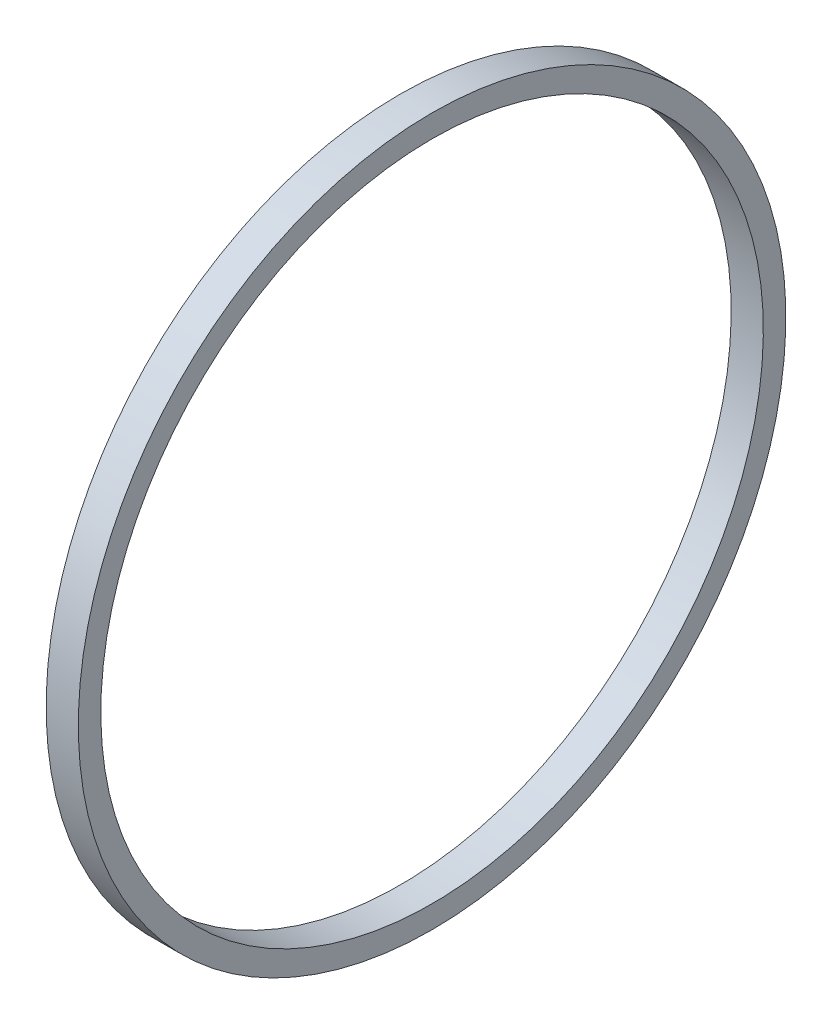
ISO-10303-21;
HEADER;
FILE_DESCRIPTION(('STEP AP214'),'2;1');
FILE_NAME('part.step','',(''),(''),'','','');
FILE_SCHEMA(('AUTOMOTIVE_DESIGN { 1 0 10303 214 1 1 1 1 }'));
ENDSEC;
DATA;
#1=APPLICATION_CONTEXT('core data for automotive mechanical design processes');
#2=APPLICATION_PROTOCOL_DEFINITION('international standard','automotive_design',2000,#1);
#3=PRODUCT_CONTEXT('',#1,'mechanical');
#4=PRODUCT('Part','Part','',(#3));
#5=PRODUCT_RELATED_PRODUCT_CATEGORY('part','',(#4));
#6=PRODUCT_DEFINITION_FORMATION('','',#4);
#7=PRODUCT_DEFINITION_CONTEXT('part definition',#1,'design');
#8=PRODUCT_DEFINITION('design','',#6,#7);
#9=PRODUCT_DEFINITION_SHAPE('','',#8);
#10=(LENGTH_UNIT() NAMED_UNIT(*) SI_UNIT(.MILLI.,.METRE.));
#11=(NAMED_UNIT(*) PLANE_ANGLE_UNIT() SI_UNIT($,.RADIAN.));
#12=(NAMED_UNIT(*) SI_UNIT($,.STERADIAN.) SOLID_ANGLE_UNIT());
#13=UNCERTAINTY_MEASURE_WITH_UNIT(LENGTH_MEASURE(1.E-05),#10,'distance_accuracy_value','');
#14=(GEOMETRIC_REPRESENTATION_CONTEXT(3) GLOBAL_UNCERTAINTY_ASSIGNED_CONTEXT((#13)) GLOBAL_UNIT_ASSIGNED_CONTEXT((#10,
#11,#12)) REPRESENTATION_CONTEXT('',''));
#15=CARTESIAN_POINT('',(0.,0.,0.));
#16=DIRECTION('',(0.,0.,1.));
#17=DIRECTION('',(1.,0.,0.));
#18=AXIS2_PLACEMENT_3D('',#15,#16,#17);
#19=CARTESIAN_POINT('',(0.,0.,0.));
#20=DIRECTION('',(1.,0.,0.));
#21=DIRECTION('',(0.,1.,0.));
#22=AXIS2_PLACEMENT_3D('',#19,#20,#21);
#23=PLANE('',#22);
#24=CARTESIAN_POINT('',(0.,0.,0.));
#25=DIRECTION('',(-1.,0.,0.));
#26=DIRECTION('',(0.,-1.,0.));
#27=AXIS2_PLACEMENT_3D('',#24,#25,#26);
#28=CIRCLE('',#27,51.5);
#29=CARTESIAN_POINT('',(0.,51.5,0.));
#30=VERTEX_POINT('',#29);
#31=EDGE_CURVE('E59',#30,#30,#28,.T.);
#32=ORIENTED_EDGE('',*,*,#31,.F.);
#33=EDGE_LOOP('',(#32));
#34=FACE_BOUND('',#33,.T.);
#35=CARTESIAN_POINT('',(0.,0.,0.));
#36=DIRECTION('',(1.,0.,0.));
#37=DIRECTION('',(0.,1.,0.));
#38=AXIS2_PLACEMENT_3D('',#35,#36,#37);
#39=CIRCLE('',#38,55.);
#40=CARTESIAN_POINT('',(0.,-55.,0.));
#41=VERTEX_POINT('',#40);
#42=EDGE_CURVE('E11',#41,#41,#39,.T.);
#43=ORIENTED_EDGE('',*,*,#42,.F.);
#44=EDGE_LOOP('',(#43));
#45=FACE_BOUND('',#44,.T.);
#46=ADVANCED_FACE('F17',(#34,#45),#23,.F.);
#47=CARTESIAN_POINT('',(5.,0.,0.));
#48=DIRECTION('',(1.,0.,0.));
#49=DIRECTION('',(0.,1.,0.));
#50=AXIS2_PLACEMENT_3D('',#47,#48,#49);
#51=PLANE('',#50);
#52=CARTESIAN_POINT('',(5.,0.,0.));
#53=DIRECTION('',(-1.,0.,0.));
#54=DIRECTION('',(0.,-1.,0.));
#55=AXIS2_PLACEMENT_3D('',#52,#53,#54);
#56=CIRCLE('',#55,51.5);
#57=CARTESIAN_POINT('',(5.,51.5,0.));
#58=VERTEX_POINT('',#57);
#59=EDGE_CURVE('E57',#58,#58,#56,.T.);
#60=ORIENTED_EDGE('',*,*,#59,.T.);
#61=EDGE_LOOP('',(#60));
#62=FACE_BOUND('',#61,.T.);
#63=CARTESIAN_POINT('',(5.,0.,0.));
#64=DIRECTION('',(1.,0.,0.));
#65=DIRECTION('',(0.,1.,0.));
#66=AXIS2_PLACEMENT_3D('',#63,#64,#65);
#67=CIRCLE('',#66,55.);
#68=CARTESIAN_POINT('',(5.,-55.,0.));
#69=VERTEX_POINT('',#68);
#70=EDGE_CURVE('E21',#69,#69,#67,.T.);
#71=ORIENTED_EDGE('',*,*,#70,.T.);
#72=EDGE_LOOP('',(#71));
#73=FACE_BOUND('',#72,.T.);
#74=ADVANCED_FACE('F19',(#62,#73),#51,.T.);
#75=CARTESIAN_POINT('',(0.,0.,0.));
#76=DIRECTION('',(1.,0.,0.));
#77=DIRECTION('',(0.,1.,0.));
#78=AXIS2_PLACEMENT_3D('',#75,#76,#77);
#79=CYLINDRICAL_SURFACE('',#78,55.);
#80=ORIENTED_EDGE('',*,*,#70,.F.);
#81=DIRECTION('',(-1.,0.,0.));
#82=VECTOR('',#81,1.);
#83=CARTESIAN_POINT('',(0.,-55.,0.));
#84=LINE('',#83,#82);
#85=EDGE_CURVE('E27',#69,#41,#84,.T.);
#86=ORIENTED_EDGE('',*,*,#85,.T.);
#87=ORIENTED_EDGE('',*,*,#42,.T.);
#88=ORIENTED_EDGE('',*,*,#85,.F.);
#89=EDGE_LOOP('',(#80,#86,#87,#88));
#90=FACE_BOUND('',#89,.T.);
#91=ADVANCED_FACE('F74',(#90),#79,.T.);
#92=CARTESIAN_POINT('',(0.,0.,0.));
#93=DIRECTION('',(1.,0.,0.));
#94=DIRECTION('',(0.,-1.,0.));
#95=AXIS2_PLACEMENT_3D('',#92,#93,#94);
#96=CYLINDRICAL_SURFACE('',#95,51.5);
#97=ORIENTED_EDGE('',*,*,#59,.F.);
#98=DIRECTION('',(-1.,0.,0.));
#99=VECTOR('',#98,1.);
#100=CARTESIAN_POINT('',(0.,51.5,0.));
#101=LINE('',#100,#99);
#102=EDGE_CURVE('E54',#58,#30,#101,.T.);
#103=ORIENTED_EDGE('',*,*,#102,.T.);
#104=ORIENTED_EDGE('',*,*,#31,.T.);
#105=ORIENTED_EDGE('',*,*,#102,.F.);
#106=EDGE_LOOP('',(#97,#103,#104,#105));
#107=FACE_BOUND('',#106,.T.);
#108=ADVANCED_FACE('F56',(#107),#96,.F.);
#109=CLOSED_SHELL('',(#46,#74,#91,#108));
#110=MANIFOLD_SOLID_BREP('B1',#109);
#111=ADVANCED_BREP_SHAPE_REPRESENTATION('',(#18,#110),#14);
#112=SHAPE_DEFINITION_REPRESENTATION(#9,#111);
ENDSEC;
END-ISO-10303-21;
